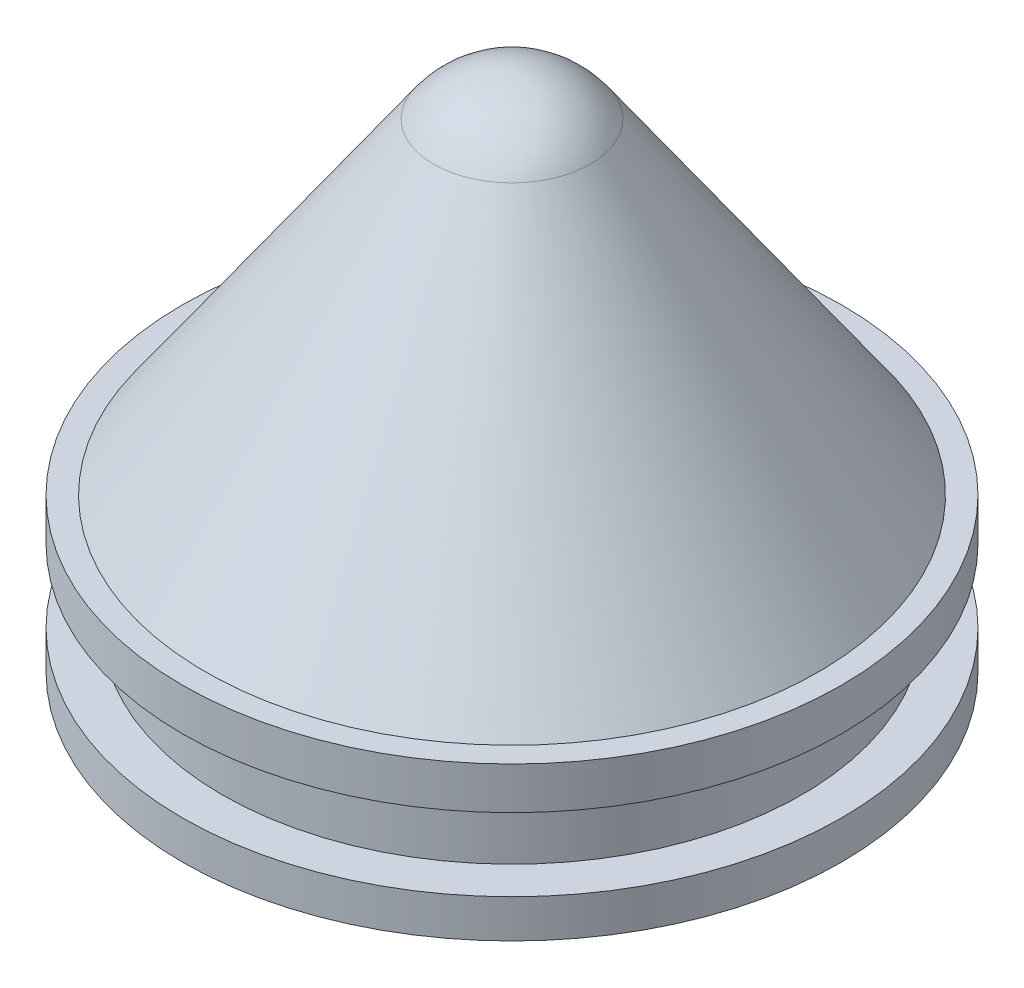
ISO-10303-21;
HEADER;
FILE_DESCRIPTION(('STEP AP214'),'2;1');
FILE_NAME('part.step','',(''),(''),'','','');
FILE_SCHEMA(('AUTOMOTIVE_DESIGN { 1 0 10303 214 1 1 1 1 }'));
ENDSEC;
DATA;
#1=APPLICATION_CONTEXT('core data for automotive mechanical design processes');
#2=APPLICATION_PROTOCOL_DEFINITION('international standard','automotive_design',2000,#1);
#3=PRODUCT_CONTEXT('',#1,'mechanical');
#4=PRODUCT('Part','Part','',(#3));
#5=PRODUCT_RELATED_PRODUCT_CATEGORY('part','',(#4));
#6=PRODUCT_DEFINITION_FORMATION('','',#4);
#7=PRODUCT_DEFINITION_CONTEXT('part definition',#1,'design');
#8=PRODUCT_DEFINITION('design','',#6,#7);
#9=PRODUCT_DEFINITION_SHAPE('','',#8);
#10=(LENGTH_UNIT() NAMED_UNIT(*) SI_UNIT(.MILLI.,.METRE.));
#11=(NAMED_UNIT(*) PLANE_ANGLE_UNIT() SI_UNIT($,.RADIAN.));
#12=(NAMED_UNIT(*) SI_UNIT($,.STERADIAN.) SOLID_ANGLE_UNIT());
#13=UNCERTAINTY_MEASURE_WITH_UNIT(LENGTH_MEASURE(1.E-05),#10,'distance_accuracy_value','');
#14=(GEOMETRIC_REPRESENTATION_CONTEXT(3) GLOBAL_UNCERTAINTY_ASSIGNED_CONTEXT((#13)) GLOBAL_UNIT_ASSIGNED_CONTEXT((#10,
#11,#12)) REPRESENTATION_CONTEXT('',''));
#15=CARTESIAN_POINT('',(0.,0.,0.));
#16=DIRECTION('',(0.,0.,1.));
#17=DIRECTION('',(1.,0.,0.));
#18=AXIS2_PLACEMENT_3D('',#15,#16,#17);
#19=CARTESIAN_POINT('',(0.,5.08,0.));
#20=DIRECTION('',(0.,1.,0.));
#21=DIRECTION('',(0.,0.,1.));
#22=AXIS2_PLACEMENT_3D('',#19,#20,#21);
#23=PLANE('',#22);
#24=CARTESIAN_POINT('',(0.,5.08,0.));
#25=DIRECTION('',(0.,1.,0.));
#26=DIRECTION('',(0.,0.,1.));
#27=AXIS2_PLACEMENT_3D('',#24,#25,#26);
#28=CIRCLE('',#27,10.922);
#29=CARTESIAN_POINT('',(0.,5.08,10.922));
#30=VERTEX_POINT('',#29);
#31=EDGE_CURVE('E10',#30,#30,#28,.T.);
#32=ORIENTED_EDGE('',*,*,#31,.T.);
#33=EDGE_LOOP('',(#32));
#34=FACE_BOUND('',#33,.T.);
#35=CARTESIAN_POINT('',(0.,5.08,0.));
#36=DIRECTION('',(0.,1.,0.));
#37=DIRECTION('',(0.,0.,1.));
#38=AXIS2_PLACEMENT_3D('',#35,#36,#37);
#39=CIRCLE('',#38,10.16);
#40=CARTESIAN_POINT('',(0.,5.08,-10.16));
#41=VERTEX_POINT('',#40);
#42=EDGE_CURVE('E64',#41,#41,#39,.T.);
#43=ORIENTED_EDGE('',*,*,#42,.F.);
#44=EDGE_LOOP('',(#43));
#45=FACE_BOUND('',#44,.T.);
#46=ADVANCED_FACE('F33',(#34,#45),#23,.T.);
#47=CARTESIAN_POINT('',(0.,5.08,0.));
#48=DIRECTION('',(0.,-1.,0.));
#49=DIRECTION('',(0.,0.,-1.));
#50=AXIS2_PLACEMENT_3D('',#47,#48,#49);
#51=CYLINDRICAL_SURFACE('',#50,10.922);
#52=CARTESIAN_POINT('',(0.,1.27,0.));
#53=DIRECTION('',(0.,-1.,0.));
#54=DIRECTION('',(0.,0.,-1.));
#55=AXIS2_PLACEMENT_3D('',#52,#53,#54);
#56=CIRCLE('',#55,10.922);
#57=CARTESIAN_POINT('',(0.,1.27,-10.922));
#58=VERTEX_POINT('',#57);
#59=EDGE_CURVE('E37',#58,#58,#56,.T.);
#60=ORIENTED_EDGE('',*,*,#59,.T.);
#61=EDGE_LOOP('',(#60));
#62=FACE_BOUND('',#61,.T.);
#63=CARTESIAN_POINT('',(0.,0.,0.));
#64=DIRECTION('',(0.,1.,0.));
#65=DIRECTION('',(0.,0.,1.));
#66=AXIS2_PLACEMENT_3D('',#63,#64,#65);
#67=CIRCLE('',#66,10.922);
#68=CARTESIAN_POINT('',(0.,0.,10.922));
#69=VERTEX_POINT('',#68);
#70=EDGE_CURVE('E41',#69,#69,#67,.T.);
#71=ORIENTED_EDGE('',*,*,#70,.T.);
#72=EDGE_LOOP('',(#71));
#73=FACE_BOUND('',#72,.T.);
#74=ADVANCED_FACE('F73',(#62,#73),#51,.T.);
#75=CARTESIAN_POINT('',(0.,0.,0.));
#76=DIRECTION('',(0.,1.,0.));
#77=DIRECTION('',(0.,0.,1.));
#78=AXIS2_PLACEMENT_3D('',#75,#76,#77);
#79=PLANE('',#78);
#80=ORIENTED_EDGE('',*,*,#70,.F.);
#81=EDGE_LOOP('',(#80));
#82=FACE_BOUND('',#81,.T.);
#83=ADVANCED_FACE('F78',(#82),#79,.F.);
#84=CARTESIAN_POINT('',(9.6012,1.27,0.));
#85=DIRECTION('',(0.,-1.,0.));
#86=DIRECTION('',(0.,0.,-1.));
#87=AXIS2_PLACEMENT_3D('',#84,#85,#86);
#88=PLANE('',#87);
#89=CARTESIAN_POINT('',(0.,1.27,0.));
#90=DIRECTION('',(0.,-1.,0.));
#91=DIRECTION('',(0.,0.,-1.));
#92=AXIS2_PLACEMENT_3D('',#89,#90,#91);
#93=CIRCLE('',#92,9.6012);
#94=CARTESIAN_POINT('',(0.,1.27,-9.6012));
#95=VERTEX_POINT('',#94);
#96=EDGE_CURVE('E48',#95,#95,#93,.T.);
#97=ORIENTED_EDGE('',*,*,#96,.T.);
#98=EDGE_LOOP('',(#97));
#99=FACE_BOUND('',#98,.T.);
#100=ORIENTED_EDGE('',*,*,#59,.F.);
#101=EDGE_LOOP('',(#100));
#102=FACE_BOUND('',#101,.T.);
#103=ADVANCED_FACE('F84',(#99,#102),#88,.F.);
#104=CARTESIAN_POINT('',(9.6012,3.683,0.));
#105=DIRECTION('',(0.,1.,0.));
#106=DIRECTION('',(0.,0.,1.));
#107=AXIS2_PLACEMENT_3D('',#104,#105,#106);
#108=PLANE('',#107);
#109=CARTESIAN_POINT('',(0.,3.683,0.));
#110=DIRECTION('',(0.,-1.,0.));
#111=DIRECTION('',(0.,0.,-1.));
#112=AXIS2_PLACEMENT_3D('',#109,#110,#111);
#113=CIRCLE('',#112,9.6012);
#114=CARTESIAN_POINT('',(0.,3.683,-9.6012));
#115=VERTEX_POINT('',#114);
#116=EDGE_CURVE('E56',#115,#115,#113,.T.);
#117=ORIENTED_EDGE('',*,*,#116,.F.);
#118=EDGE_LOOP('',(#117));
#119=FACE_BOUND('',#118,.T.);
#120=CARTESIAN_POINT('',(0.,3.683,0.));
#121=DIRECTION('',(0.,1.,0.));
#122=DIRECTION('',(0.,0.,1.));
#123=AXIS2_PLACEMENT_3D('',#120,#121,#122);
#124=CIRCLE('',#123,10.922);
#125=CARTESIAN_POINT('',(0.,3.683,10.922));
#126=VERTEX_POINT('',#125);
#127=EDGE_CURVE('E50',#126,#126,#124,.T.);
#128=ORIENTED_EDGE('',*,*,#127,.F.);
#129=EDGE_LOOP('',(#128));
#130=FACE_BOUND('',#129,.T.);
#131=ADVANCED_FACE('F89',(#119,#130),#108,.F.);
#132=CARTESIAN_POINT('',(0.,0.,0.));
#133=DIRECTION('',(0.,-1.,0.));
#134=DIRECTION('',(0.,0.,-1.));
#135=AXIS2_PLACEMENT_3D('',#132,#133,#134);
#136=CYLINDRICAL_SURFACE('',#135,9.6012);
#137=ORIENTED_EDGE('',*,*,#96,.F.);
#138=EDGE_LOOP('',(#137));
#139=FACE_BOUND('',#138,.T.);
#140=ORIENTED_EDGE('',*,*,#116,.T.);
#141=EDGE_LOOP('',(#140));
#142=FACE_BOUND('',#141,.T.);
#143=ADVANCED_FACE('F81',(#139,#142),#136,.T.);
#144=ORIENTED_EDGE('',*,*,#127,.T.);
#145=EDGE_LOOP('',(#144));
#146=FACE_BOUND('',#145,.T.);
#147=ORIENTED_EDGE('',*,*,#31,.F.);
#148=EDGE_LOOP('',(#147));
#149=FACE_BOUND('',#148,.T.);
#150=ADVANCED_FACE('F35',(#146,#149),#51,.T.);
#151=CARTESIAN_POINT('',(0.,14.0545401724028,0.));
#152=DIRECTION('',(0.,1.,0.));
#153=DIRECTION('',(-1.,0.,0.));
#154=AXIS2_PLACEMENT_3D('',#151,#152,#153);
#155=SPHERICAL_SURFACE('',#154,3.175);
#156=CARTESIAN_POINT('',(0.,15.8756453578174,0.));
#157=DIRECTION('',(0.,1.,0.));
#158=DIRECTION('',(0.,0.,1.));
#159=AXIS2_PLACEMENT_3D('',#156,#157,#158);
#160=CIRCLE('',#159,2.60080774061754);
#161=CARTESIAN_POINT('',(0.,15.8756453578174,-2.60080774061754));
#162=VERTEX_POINT('',#161);
#163=EDGE_CURVE('E60',#162,#162,#160,.T.);
#164=ORIENTED_EDGE('',*,*,#163,.T.);
#165=EDGE_LOOP('',(#164));
#166=FACE_BOUND('',#165,.T.);
#167=ADVANCED_FACE('F99',(#166),#155,.T.);
#168=CARTESIAN_POINT('',(0.,5.08,0.));
#169=DIRECTION('',(0.,-1.,0.));
#170=DIRECTION('',(0.,0.,-1.));
#171=AXIS2_PLACEMENT_3D('',#168,#169,#170);
#172=CONICAL_SURFACE('',#171,10.16,0.61086523819802);
#173=CARTESIAN_POINT('',(0.,15.8756453578174,-2.60080774061754));
#174=CARTESIAN_POINT('',(0.,15.7631907186734,-2.67954932665278));
#175=CARTESIAN_POINT('',(0.,15.6507360795295,-2.75829091268801));
#176=CARTESIAN_POINT('',(0.,15.4258268012417,-2.91577408475848));
#177=CARTESIAN_POINT('',(0.,15.3133721620977,-2.99451567079371));
#178=CARTESIAN_POINT('',(0.,15.0884628838099,-3.15199884286418));
#179=CARTESIAN_POINT('',(0.,14.9760082446659,-3.23074042889942));
#180=CARTESIAN_POINT('',(0.,14.7510989663781,-3.38822360096988));
#181=CARTESIAN_POINT('',(0.,14.6386443272341,-3.46696518700512));
#182=CARTESIAN_POINT('',(0.,14.4137350489463,-3.62444835907559));
#183=CARTESIAN_POINT('',(0.,14.3012804098023,-3.70318994511082));
#184=CARTESIAN_POINT('',(0.,14.0763711315145,-3.86067311718129));
#185=CARTESIAN_POINT('',(0.,13.9639164923706,-3.93941470321652));
#186=CARTESIAN_POINT('',(0.,13.7390072140827,-4.09689787528699));
#187=CARTESIAN_POINT('',(0.,13.6265525749388,-4.17563946132222));
#188=CARTESIAN_POINT('',(0.,13.4016432966509,-4.33312263339269));
#189=CARTESIAN_POINT('',(0.,13.289188657507,-4.41186421942792));
#190=CARTESIAN_POINT('',(0.,13.0642793792191,-4.56934739149839));
#191=CARTESIAN_POINT('',(0.,12.9518247400752,-4.64808897753363));
#192=CARTESIAN_POINT('',(0.,12.7269154617873,-4.80557214960409));
#193=CARTESIAN_POINT('',(0.,12.6144608226434,-4.88431373563933));
#194=CARTESIAN_POINT('',(0.,12.3895515443555,-5.0417969077098));
#195=CARTESIAN_POINT('',(0.,12.2770969052116,-5.12053849374503));
#196=CARTESIAN_POINT('',(0.,12.0521876269237,-5.2780216658155));
#197=CARTESIAN_POINT('',(0.,11.9397329877798,-5.35676325185073));
#198=CARTESIAN_POINT('',(0.,11.7148237094919,-5.5142464239212));
#199=CARTESIAN_POINT('',(0.,11.602369070348,-5.59298800995643));
#200=CARTESIAN_POINT('',(0.,11.3774597920601,-5.7504711820269));
#201=CARTESIAN_POINT('',(0.,11.2650051529162,-5.82921276806213));
#202=CARTESIAN_POINT('',(0.,11.0400958746283,-5.9866959401326));
#203=CARTESIAN_POINT('',(0.,10.9276412354844,-6.06543752616784));
#204=CARTESIAN_POINT('',(0.,10.7027319571966,-6.2229206982383));
#205=CARTESIAN_POINT('',(0.,10.5902773180526,-6.30166228427354));
#206=CARTESIAN_POINT('',(0.,10.3653680397648,-6.45914545634401));
#207=CARTESIAN_POINT('',(0.,10.2529134006208,-6.53788704237924));
#208=CARTESIAN_POINT('',(0.,10.028004122333,-6.69537021444971));
#209=CARTESIAN_POINT('',(0.,9.91554948318903,-6.77411180048494));
#210=CARTESIAN_POINT('',(0.,9.69064020490117,-6.93159497255541));
#211=CARTESIAN_POINT('',(0.,9.57818556575724,-7.01033655859064));
#212=CARTESIAN_POINT('',(0.,9.35327628746938,-7.16781973066111));
#213=CARTESIAN_POINT('',(0.,9.24082164832545,-7.24656131669635));
#214=CARTESIAN_POINT('',(0.,9.01591237003759,-7.40404448876681));
#215=CARTESIAN_POINT('',(0.,8.90345773089365,-7.48278607480205));
#216=CARTESIAN_POINT('',(0.,8.67854845260579,-7.64026924687252));
#217=CARTESIAN_POINT('',(0.,8.56609381346186,-7.71901083290775));
#218=CARTESIAN_POINT('',(0.,8.341184535174,-7.87649400497822));
#219=CARTESIAN_POINT('',(0.,8.22872989603007,-7.95523559101345));
#220=CARTESIAN_POINT('',(0.,8.00382061774221,-8.11271876308392));
#221=CARTESIAN_POINT('',(0.,7.89136597859828,-8.19146034911915));
#222=CARTESIAN_POINT('',(0.,7.66645670031042,-8.34894352118962));
#223=CARTESIAN_POINT('',(0.,7.55400206116648,-8.42768510722486));
#224=CARTESIAN_POINT('',(0.,7.32909278287862,-8.58516827929532));
#225=CARTESIAN_POINT('',(0.,7.21663814373469,-8.66390986533056));
#226=CARTESIAN_POINT('',(0.,6.99172886544683,-8.82139303740102));
#227=CARTESIAN_POINT('',(0.,6.8792742263029,-8.90013462343626));
#228=CARTESIAN_POINT('',(0.,6.65436494801503,-9.05761779550673));
#229=CARTESIAN_POINT('',(0.,6.5419103088711,-9.13635938154196));
#230=CARTESIAN_POINT('',(0.,6.31700103058324,-9.29384255361243));
#231=CARTESIAN_POINT('',(0.,6.20454639143931,-9.37258413964766));
#232=CARTESIAN_POINT('',(0.,5.97963711315145,-9.53006731171813));
#233=CARTESIAN_POINT('',(0.,5.86718247400752,-9.60880889775336));
#234=CARTESIAN_POINT('',(0.,5.64227319571966,-9.76629206982383));
#235=CARTESIAN_POINT('',(0.,5.52981855657572,-9.84503365585907));
#236=CARTESIAN_POINT('',(0.,5.30490927828786,-10.0025168279295));
#237=CARTESIAN_POINT('',(0.,5.19245463914393,-10.0812584139648));
#238=CARTESIAN_POINT('',(0.,5.08,-10.16));
#239=B_SPLINE_CURVE_WITH_KNOTS('',3,(#173,#174,#175,#176,#177,#178,#179,#180,#181,#182,#183,
#184,#185,#186,#187,#188,#189,#190,#191,#192,#193,#194,#195,#196,#197,#198,#199,#200,#201,#202,
#203,#204,#205,#206,#207,#208,#209,#210,#211,#212,#213,#214,#215,#216,#217,#218,#219,#220,#221,
#222,#223,#224,#225,#226,#227,#228,#229,#230,#231,#232,#233,#234,#235,#236,#237,#238),
.UNSPECIFIED.,.F.,.F.,(4,2,2,2,2,2,2,2,2,2,2,2,2,2,2,2,2,2,2,2,2,2,2,2,2,2,2,2,2,2,2,2,4),(0.,
0.411845297565751,0.823690595131504,1.23553589269726,1.64738119026301,2.05922648782876,
2.47107178539451,2.88291708296026,3.29476238052602,3.70660767809177,4.11845297565752,
4.53029827322327,4.94214357078903,5.35398886835478,5.76583416592053,6.17767946348628,
6.58952476105203,7.00137005861779,7.41321535618354,7.82506065374929,8.23690595131504,
8.64875124888079,9.06059654644655,9.4724418440123,9.88428714157805,10.2961324391438,
10.7079777367096,11.1198230342753,11.5316683318411,11.9435136294068,12.3553589269726,
12.7672042245383,13.1790495221041),.UNSPECIFIED.);
#240=EDGE_CURVE('BSEAM70',#162,#41,#239,.T.);
#241=ORIENTED_EDGE('',*,*,#163,.F.);
#242=ORIENTED_EDGE('',*,*,#42,.T.);
#243=ORIENTED_EDGE('',*,*,#240,.T.);
#244=ORIENTED_EDGE('',*,*,#240,.F.);
#245=EDGE_LOOP('',(#241,#243,#242,#244));
#246=FACE_BOUND('',#245,.T.);
#247=ADVANCED_FACE('F70',(#246),#172,.T.);
#248=CLOSED_SHELL('',(#46,#74,#83,#103,#131,#143,#150,#167,#247));
#249=MANIFOLD_SOLID_BREP('B2',#248);
#250=ADVANCED_BREP_SHAPE_REPRESENTATION('',(#18,#249),#14);
#251=SHAPE_DEFINITION_REPRESENTATION(#9,#250);
ENDSEC;
END-ISO-10303-21;
